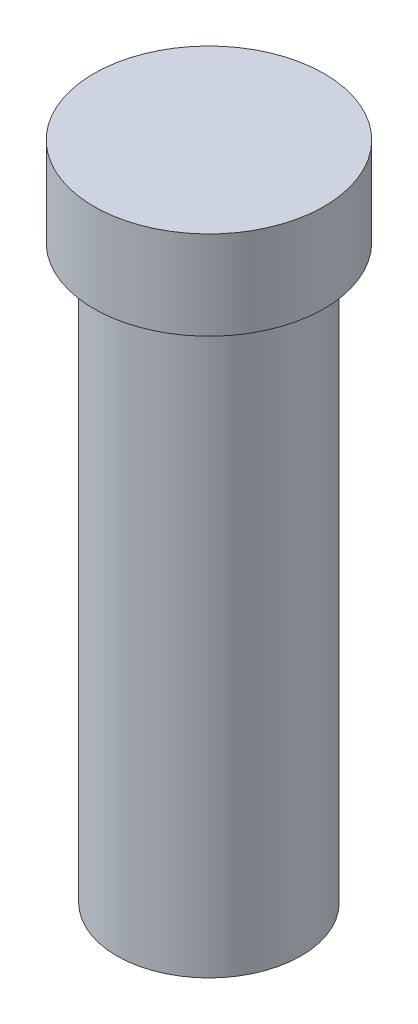
ISO-10303-21;
HEADER;
FILE_DESCRIPTION(('STEP AP214'),'2;1');
FILE_NAME('part.step','',(''),(''),'','','');
FILE_SCHEMA(('AUTOMOTIVE_DESIGN { 1 0 10303 214 1 1 1 1 }'));
ENDSEC;
DATA;
#1=APPLICATION_CONTEXT('core data for automotive mechanical design processes');
#2=APPLICATION_PROTOCOL_DEFINITION('international standard','automotive_design',2000,#1);
#3=PRODUCT_CONTEXT('',#1,'mechanical');
#4=PRODUCT('Part','Part','',(#3));
#5=PRODUCT_RELATED_PRODUCT_CATEGORY('part','',(#4));
#6=PRODUCT_DEFINITION_FORMATION('','',#4);
#7=PRODUCT_DEFINITION_CONTEXT('part definition',#1,'design');
#8=PRODUCT_DEFINITION('design','',#6,#7);
#9=PRODUCT_DEFINITION_SHAPE('','',#8);
#10=(LENGTH_UNIT() NAMED_UNIT(*) SI_UNIT(.MILLI.,.METRE.));
#11=(NAMED_UNIT(*) PLANE_ANGLE_UNIT() SI_UNIT($,.RADIAN.));
#12=(NAMED_UNIT(*) SI_UNIT($,.STERADIAN.) SOLID_ANGLE_UNIT());
#13=UNCERTAINTY_MEASURE_WITH_UNIT(LENGTH_MEASURE(1.E-05),#10,'distance_accuracy_value','');
#14=(GEOMETRIC_REPRESENTATION_CONTEXT(3) GLOBAL_UNCERTAINTY_ASSIGNED_CONTEXT((#13)) GLOBAL_UNIT_ASSIGNED_CONTEXT((#10,
#11,#12)) REPRESENTATION_CONTEXT('',''));
#15=CARTESIAN_POINT('',(0.,0.,0.));
#16=DIRECTION('',(0.,0.,1.));
#17=DIRECTION('',(1.,0.,0.));
#18=AXIS2_PLACEMENT_3D('',#15,#16,#17);
#19=CARTESIAN_POINT('',(0.,0.,0.));
#20=DIRECTION('',(0.,1.,0.));
#21=DIRECTION('',(0.,0.,1.));
#22=AXIS2_PLACEMENT_3D('',#19,#20,#21);
#23=PLANE('',#22);
#24=CARTESIAN_POINT('',(0.,0.,0.));
#25=DIRECTION('',(0.,-1.,0.));
#26=DIRECTION('',(0.,0.,-1.));
#27=AXIS2_PLACEMENT_3D('',#24,#25,#26);
#28=CIRCLE('',#27,6.5);
#29=CARTESIAN_POINT('',(0.,0.,-6.5));
#30=VERTEX_POINT('',#29);
#31=EDGE_CURVE('E10',#30,#30,#28,.T.);
#32=ORIENTED_EDGE('',*,*,#31,.F.);
#33=EDGE_LOOP('',(#32));
#34=FACE_BOUND('',#33,.T.);
#35=ADVANCED_FACE('F43',(#34),#23,.T.);
#36=CARTESIAN_POINT('',(0.,-42.3,0.));
#37=DIRECTION('',(0.,-1.,0.));
#38=DIRECTION('',(0.,0.,-1.));
#39=AXIS2_PLACEMENT_3D('',#36,#37,#38);
#40=CYLINDRICAL_SURFACE('',#39,6.5);
#41=ORIENTED_EDGE('',*,*,#31,.T.);
#42=EDGE_LOOP('',(#41));
#43=FACE_BOUND('',#42,.T.);
#44=CARTESIAN_POINT('',(0.,-5.,0.));
#45=DIRECTION('',(0.,-1.,0.));
#46=DIRECTION('',(0.,0.,-1.));
#47=AXIS2_PLACEMENT_3D('',#44,#45,#46);
#48=CIRCLE('',#47,6.5);
#49=CARTESIAN_POINT('',(0.,-5.,-6.5));
#50=VERTEX_POINT('',#49);
#51=EDGE_CURVE('E50',#50,#50,#48,.T.);
#52=ORIENTED_EDGE('',*,*,#51,.F.);
#53=EDGE_LOOP('',(#52));
#54=FACE_BOUND('',#53,.T.);
#55=ADVANCED_FACE('F82',(#43,#54),#40,.T.);
#56=CARTESIAN_POINT('',(6.5,-5.,0.));
#57=DIRECTION('',(0.,-1.,0.));
#58=DIRECTION('',(0.,0.,-1.));
#59=AXIS2_PLACEMENT_3D('',#56,#57,#58);
#60=PLANE('',#59);
#61=ORIENTED_EDGE('',*,*,#51,.T.);
#62=EDGE_LOOP('',(#61));
#63=FACE_BOUND('',#62,.T.);
#64=CARTESIAN_POINT('',(0.,-5.,0.));
#65=DIRECTION('',(0.,-1.,0.));
#66=DIRECTION('',(0.,0.,-1.));
#67=AXIS2_PLACEMENT_3D('',#64,#65,#66);
#68=CIRCLE('',#67,5.2);
#69=CARTESIAN_POINT('',(0.,-5.,-5.2));
#70=VERTEX_POINT('',#69);
#71=EDGE_CURVE('E56',#70,#70,#68,.T.);
#72=ORIENTED_EDGE('',*,*,#71,.F.);
#73=EDGE_LOOP('',(#72));
#74=FACE_BOUND('',#73,.T.);
#75=ADVANCED_FACE('F74',(#63,#74),#60,.T.);
#76=CARTESIAN_POINT('',(0.,-42.3,0.));
#77=DIRECTION('',(0.,-1.,0.));
#78=DIRECTION('',(0.,0.,-1.));
#79=AXIS2_PLACEMENT_3D('',#76,#77,#78);
#80=CYLINDRICAL_SURFACE('',#79,5.2);
#81=ORIENTED_EDGE('',*,*,#71,.T.);
#82=EDGE_LOOP('',(#81));
#83=FACE_BOUND('',#82,.T.);
#84=CARTESIAN_POINT('',(0.,-37.3,0.));
#85=DIRECTION('',(0.,-1.,0.));
#86=DIRECTION('',(0.,0.,-1.));
#87=AXIS2_PLACEMENT_3D('',#84,#85,#86);
#88=CIRCLE('',#87,5.2);
#89=CARTESIAN_POINT('',(0.,-37.3,-5.2));
#90=VERTEX_POINT('',#89);
#91=EDGE_CURVE('E62',#90,#90,#88,.T.);
#92=ORIENTED_EDGE('',*,*,#91,.F.);
#93=EDGE_LOOP('',(#92));
#94=FACE_BOUND('',#93,.T.);
#95=ADVANCED_FACE('F72',(#83,#94),#80,.T.);
#96=CARTESIAN_POINT('',(5.2,-37.3,0.));
#97=DIRECTION('',(0.,-1.,0.));
#98=DIRECTION('',(0.,0.,-1.));
#99=AXIS2_PLACEMENT_3D('',#96,#97,#98);
#100=PLANE('',#99);
#101=ORIENTED_EDGE('',*,*,#91,.T.);
#102=EDGE_LOOP('',(#101));
#103=FACE_BOUND('',#102,.T.);
#104=ADVANCED_FACE('F70',(#103),#100,.T.);
#105=CLOSED_SHELL('',(#35,#55,#75,#95,#104));
#106=MANIFOLD_SOLID_BREP('B2',#105);
#107=ADVANCED_BREP_SHAPE_REPRESENTATION('',(#18,#106),#14);
#108=SHAPE_DEFINITION_REPRESENTATION(#9,#107);
ENDSEC;
END-ISO-10303-21;
